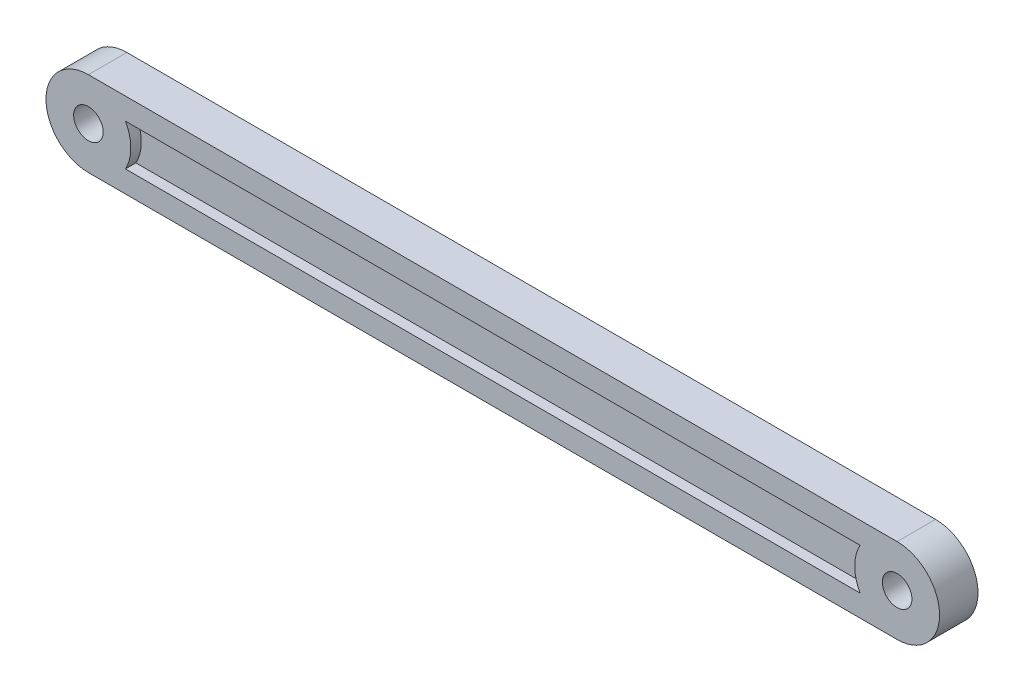
ISO-10303-21;
HEADER;
FILE_DESCRIPTION(('STEP AP214'),'2;1');
FILE_NAME('part.step','',(''),(''),'','','');
FILE_SCHEMA(('AUTOMOTIVE_DESIGN { 1 0 10303 214 1 1 1 1 }'));
ENDSEC;
DATA;
#1=APPLICATION_CONTEXT('core data for automotive mechanical design processes');
#2=APPLICATION_PROTOCOL_DEFINITION('international standard','automotive_design',2000,#1);
#3=PRODUCT_CONTEXT('',#1,'mechanical');
#4=PRODUCT('Part','Part','',(#3));
#5=PRODUCT_RELATED_PRODUCT_CATEGORY('part','',(#4));
#6=PRODUCT_DEFINITION_FORMATION('','',#4);
#7=PRODUCT_DEFINITION_CONTEXT('part definition',#1,'design');
#8=PRODUCT_DEFINITION('design','',#6,#7);
#9=PRODUCT_DEFINITION_SHAPE('','',#8);
#10=(LENGTH_UNIT() NAMED_UNIT(*) SI_UNIT(.MILLI.,.METRE.));
#11=(NAMED_UNIT(*) PLANE_ANGLE_UNIT() SI_UNIT($,.RADIAN.));
#12=(NAMED_UNIT(*) SI_UNIT($,.STERADIAN.) SOLID_ANGLE_UNIT());
#13=UNCERTAINTY_MEASURE_WITH_UNIT(LENGTH_MEASURE(1.E-05),#10,'distance_accuracy_value','');
#14=(GEOMETRIC_REPRESENTATION_CONTEXT(3) GLOBAL_UNCERTAINTY_ASSIGNED_CONTEXT((#13)) GLOBAL_UNIT_ASSIGNED_CONTEXT((#10,
#11,#12)) REPRESENTATION_CONTEXT('',''));
#15=CARTESIAN_POINT('',(0.,0.,0.));
#16=DIRECTION('',(0.,0.,1.));
#17=DIRECTION('',(1.,0.,0.));
#18=AXIS2_PLACEMENT_3D('',#15,#16,#17);
#19=CARTESIAN_POINT('',(41.,0.,1.95));
#20=DIRECTION('',(0.,0.,1.));
#21=DIRECTION('',(1.,0.,0.));
#22=AXIS2_PLACEMENT_3D('',#19,#20,#21);
#23=PLANE('',#22);
#24=CARTESIAN_POINT('',(-41.,0.,1.95));
#25=DIRECTION('',(0.,0.,1.));
#26=DIRECTION('',(1.,0.,0.));
#27=AXIS2_PLACEMENT_3D('',#24,#25,#26);
#28=CIRCLE('',#27,1.5);
#29=CARTESIAN_POINT('',(-39.5,0.,1.95));
#30=VERTEX_POINT('',#29);
#31=EDGE_CURVE('E227',#30,#30,#28,.T.);
#32=ORIENTED_EDGE('',*,*,#31,.F.);
#33=EDGE_LOOP('',(#32));
#34=FACE_BOUND('',#33,.T.);
#35=CARTESIAN_POINT('',(41.,0.,1.95));
#36=DIRECTION('',(0.,0.,1.));
#37=DIRECTION('',(1.,0.,0.));
#38=AXIS2_PLACEMENT_3D('',#35,#36,#37);
#39=CIRCLE('',#38,4.3);
#40=CARTESIAN_POINT('',(41.,-4.29999999999998,1.95));
#41=VERTEX_POINT('',#40);
#42=CARTESIAN_POINT('',(41.,4.30000000000001,1.95));
#43=VERTEX_POINT('',#42);
#44=EDGE_CURVE('E235',#41,#43,#39,.T.);
#45=ORIENTED_EDGE('',*,*,#44,.T.);
#46=DIRECTION('',(-1.,0.,0.));
#47=VECTOR('',#46,1.);
#48=CARTESIAN_POINT('',(41.,4.30000000000001,1.95));
#49=LINE('',#48,#47);
#50=CARTESIAN_POINT('',(-41.,4.29999999999999,1.95));
#51=VERTEX_POINT('',#50);
#52=EDGE_CURVE('E239',#43,#51,#49,.T.);
#53=ORIENTED_EDGE('',*,*,#52,.T.);
#54=CARTESIAN_POINT('',(-41.,0.,1.95));
#55=DIRECTION('',(0.,0.,1.));
#56=DIRECTION('',(1.,0.,0.));
#57=AXIS2_PLACEMENT_3D('',#54,#55,#56);
#58=CIRCLE('',#57,4.3);
#59=CARTESIAN_POINT('',(-41.,-4.30000000000001,1.95));
#60=VERTEX_POINT('',#59);
#61=EDGE_CURVE('E243',#51,#60,#58,.T.);
#62=ORIENTED_EDGE('',*,*,#61,.T.);
#63=DIRECTION('',(1.,0.,0.));
#64=VECTOR('',#63,1.);
#65=CARTESIAN_POINT('',(41.,-4.29999999999998,1.95));
#66=LINE('',#65,#64);
#67=EDGE_CURVE('E246',#60,#41,#66,.T.);
#68=ORIENTED_EDGE('',*,*,#67,.T.);
#69=EDGE_LOOP('',(#45,#53,#62,#68));
#70=FACE_BOUND('',#69,.T.);
#71=CARTESIAN_POINT('',(41.,0.,1.95));
#72=DIRECTION('',(0.,0.,1.));
#73=DIRECTION('',(1.,0.,0.));
#74=AXIS2_PLACEMENT_3D('',#71,#72,#73);
#75=CIRCLE('',#74,1.5);
#76=CARTESIAN_POINT('',(42.5,0.,1.95));
#77=VERTEX_POINT('',#76);
#78=EDGE_CURVE('E219',#77,#77,#75,.T.);
#79=ORIENTED_EDGE('',*,*,#78,.F.);
#80=EDGE_LOOP('',(#79));
#81=FACE_BOUND('',#80,.T.);
#82=DIRECTION('',(-1.,0.,0.));
#83=VECTOR('',#82,1.);
#84=CARTESIAN_POINT('',(0.,2.10000000000001,1.95));
#85=LINE('',#84,#83);
#86=CARTESIAN_POINT('',(37.2476673921413,2.10000000000001,1.95));
#87=VERTEX_POINT('',#86);
#88=CARTESIAN_POINT('',(-37.2476673921413,2.10000000000001,1.95));
#89=VERTEX_POINT('',#88);
#90=EDGE_CURVE('E196',#87,#89,#85,.T.);
#91=ORIENTED_EDGE('',*,*,#90,.F.);
#92=CARTESIAN_POINT('',(41.,0.,1.95));
#93=DIRECTION('',(0.,0.,1.));
#94=DIRECTION('',(1.,0.,0.));
#95=AXIS2_PLACEMENT_3D('',#92,#93,#94);
#96=CIRCLE('',#95,4.3);
#97=CARTESIAN_POINT('',(37.2476673921413,-2.09999999999999,1.95));
#98=VERTEX_POINT('',#97);
#99=EDGE_CURVE('E63',#87,#98,#96,.T.);
#100=ORIENTED_EDGE('',*,*,#99,.T.);
#101=DIRECTION('',(1.,0.,0.));
#102=VECTOR('',#101,1.);
#103=CARTESIAN_POINT('',(0.,-2.1,1.95));
#104=LINE('',#103,#102);
#105=CARTESIAN_POINT('',(-37.2476673921413,-2.10000000000001,1.95));
#106=VERTEX_POINT('',#105);
#107=EDGE_CURVE('E182',#106,#98,#104,.T.);
#108=ORIENTED_EDGE('',*,*,#107,.F.);
#109=CARTESIAN_POINT('',(-41.,0.,1.95));
#110=DIRECTION('',(0.,0.,1.));
#111=DIRECTION('',(1.,0.,0.));
#112=AXIS2_PLACEMENT_3D('',#109,#110,#111);
#113=CIRCLE('',#112,4.3);
#114=EDGE_CURVE('E200',#106,#89,#113,.T.);
#115=ORIENTED_EDGE('',*,*,#114,.T.);
#116=EDGE_LOOP('',(#91,#100,#108,#115));
#117=FACE_BOUND('',#116,.T.);
#118=ADVANCED_FACE('F39',(#34,#70,#81,#117),#23,.T.);
#119=CARTESIAN_POINT('',(41.,0.,-1.95));
#120=DIRECTION('',(0.,0.,1.));
#121=DIRECTION('',(1.,0.,0.));
#122=AXIS2_PLACEMENT_3D('',#119,#120,#121);
#123=PLANE('',#122);
#124=DIRECTION('',(1.,0.,0.));
#125=VECTOR('',#124,1.);
#126=CARTESIAN_POINT('',(0.,-2.1,-1.95));
#127=LINE('',#126,#125);
#128=CARTESIAN_POINT('',(-37.2476673921413,-2.10000000000001,-1.95));
#129=VERTEX_POINT('',#128);
#130=CARTESIAN_POINT('',(37.2476673921413,-2.09999999999999,-1.95));
#131=VERTEX_POINT('',#130);
#132=EDGE_CURVE('E164',#129,#131,#127,.T.);
#133=ORIENTED_EDGE('',*,*,#132,.T.);
#134=CARTESIAN_POINT('',(41.,0.,-1.95));
#135=DIRECTION('',(0.,0.,1.));
#136=DIRECTION('',(1.,0.,0.));
#137=AXIS2_PLACEMENT_3D('',#134,#135,#136);
#138=CIRCLE('',#137,4.3);
#139=CARTESIAN_POINT('',(37.2476673921413,2.10000000000001,-1.95));
#140=VERTEX_POINT('',#139);
#141=EDGE_CURVE('E55',#140,#131,#138,.T.);
#142=ORIENTED_EDGE('',*,*,#141,.F.);
#143=DIRECTION('',(-1.,0.,0.));
#144=VECTOR('',#143,1.);
#145=CARTESIAN_POINT('',(0.,2.10000000000001,-1.95));
#146=LINE('',#145,#144);
#147=CARTESIAN_POINT('',(-37.2476673921413,2.10000000000001,-1.95));
#148=VERTEX_POINT('',#147);
#149=EDGE_CURVE('E151',#140,#148,#146,.T.);
#150=ORIENTED_EDGE('',*,*,#149,.T.);
#151=CARTESIAN_POINT('',(-41.,0.,-1.95));
#152=DIRECTION('',(0.,0.,1.));
#153=DIRECTION('',(1.,0.,0.));
#154=AXIS2_PLACEMENT_3D('',#151,#152,#153);
#155=CIRCLE('',#154,4.3);
#156=EDGE_CURVE('E155',#129,#148,#155,.T.);
#157=ORIENTED_EDGE('',*,*,#156,.F.);
#158=EDGE_LOOP('',(#133,#142,#150,#157));
#159=FACE_BOUND('',#158,.T.);
#160=CARTESIAN_POINT('',(41.,0.,-1.95));
#161=DIRECTION('',(0.,0.,1.));
#162=DIRECTION('',(1.,0.,0.));
#163=AXIS2_PLACEMENT_3D('',#160,#161,#162);
#164=CIRCLE('',#163,4.3);
#165=CARTESIAN_POINT('',(41.,-4.29999999999998,-1.95));
#166=VERTEX_POINT('',#165);
#167=CARTESIAN_POINT('',(41.,4.30000000000001,-1.95));
#168=VERTEX_POINT('',#167);
#169=EDGE_CURVE('E231',#166,#168,#164,.T.);
#170=ORIENTED_EDGE('',*,*,#169,.F.);
#171=DIRECTION('',(1.,0.,0.));
#172=VECTOR('',#171,1.);
#173=CARTESIAN_POINT('',(41.,-4.29999999999998,-1.95));
#174=LINE('',#173,#172);
#175=CARTESIAN_POINT('',(-41.,-4.30000000000001,-1.95));
#176=VERTEX_POINT('',#175);
#177=EDGE_CURVE('E240',#176,#166,#174,.T.);
#178=ORIENTED_EDGE('',*,*,#177,.F.);
#179=CARTESIAN_POINT('',(-41.,0.,-1.95));
#180=DIRECTION('',(0.,0.,1.));
#181=DIRECTION('',(1.,0.,0.));
#182=AXIS2_PLACEMENT_3D('',#179,#180,#181);
#183=CIRCLE('',#182,4.3);
#184=CARTESIAN_POINT('',(-41.,4.29999999999999,-1.95));
#185=VERTEX_POINT('',#184);
#186=EDGE_CURVE('E256',#185,#176,#183,.T.);
#187=ORIENTED_EDGE('',*,*,#186,.F.);
#188=DIRECTION('',(-1.,0.,0.));
#189=VECTOR('',#188,1.);
#190=CARTESIAN_POINT('',(41.,4.30000000000001,-1.95));
#191=LINE('',#190,#189);
#192=EDGE_CURVE('E253',#168,#185,#191,.T.);
#193=ORIENTED_EDGE('',*,*,#192,.F.);
#194=EDGE_LOOP('',(#170,#178,#187,#193));
#195=FACE_BOUND('',#194,.T.);
#196=CARTESIAN_POINT('',(-41.,0.,-1.95));
#197=DIRECTION('',(0.,0.,1.));
#198=DIRECTION('',(1.,0.,0.));
#199=AXIS2_PLACEMENT_3D('',#196,#197,#198);
#200=CIRCLE('',#199,1.5);
#201=CARTESIAN_POINT('',(-39.5,0.,-1.95));
#202=VERTEX_POINT('',#201);
#203=EDGE_CURVE('E223',#202,#202,#200,.T.);
#204=ORIENTED_EDGE('',*,*,#203,.T.);
#205=EDGE_LOOP('',(#204));
#206=FACE_BOUND('',#205,.T.);
#207=CARTESIAN_POINT('',(41.,0.,-1.95));
#208=DIRECTION('',(0.,0.,1.));
#209=DIRECTION('',(1.,0.,0.));
#210=AXIS2_PLACEMENT_3D('',#207,#208,#209);
#211=CIRCLE('',#210,1.5);
#212=CARTESIAN_POINT('',(42.5,0.,-1.95));
#213=VERTEX_POINT('',#212);
#214=EDGE_CURVE('E210',#213,#213,#211,.T.);
#215=ORIENTED_EDGE('',*,*,#214,.T.);
#216=EDGE_LOOP('',(#215));
#217=FACE_BOUND('',#216,.T.);
#218=ADVANCED_FACE('F279',(#159,#195,#206,#217),#123,.F.);
#219=CARTESIAN_POINT('',(41.,0.,1.95));
#220=DIRECTION('',(0.,0.,-1.));
#221=DIRECTION('',(-1.,0.,0.));
#222=AXIS2_PLACEMENT_3D('',#219,#220,#221);
#223=CYLINDRICAL_SURFACE('',#222,4.3);
#224=ORIENTED_EDGE('',*,*,#169,.T.);
#225=DIRECTION('',(0.,0.,-1.));
#226=VECTOR('',#225,1.);
#227=CARTESIAN_POINT('',(41.,4.30000000000001,1.95));
#228=LINE('',#227,#226);
#229=EDGE_CURVE('E11',#43,#168,#228,.T.);
#230=ORIENTED_EDGE('',*,*,#229,.F.);
#231=ORIENTED_EDGE('',*,*,#44,.F.);
#232=DIRECTION('',(0.,0.,-1.));
#233=VECTOR('',#232,1.);
#234=CARTESIAN_POINT('',(41.,-4.29999999999998,1.95));
#235=LINE('',#234,#233);
#236=EDGE_CURVE('E249',#41,#166,#235,.T.);
#237=ORIENTED_EDGE('',*,*,#236,.T.);
#238=EDGE_LOOP('',(#224,#230,#231,#237));
#239=FACE_BOUND('',#238,.T.);
#240=ADVANCED_FACE('F41',(#239),#223,.T.);
#241=CARTESIAN_POINT('',(41.,4.30000000000001,1.95));
#242=DIRECTION('',(0.,-1.,0.));
#243=DIRECTION('',(1.,0.,0.));
#244=AXIS2_PLACEMENT_3D('',#241,#242,#243);
#245=PLANE('',#244);
#246=ORIENTED_EDGE('',*,*,#192,.T.);
#247=DIRECTION('',(0.,0.,-1.));
#248=VECTOR('',#247,1.);
#249=CARTESIAN_POINT('',(-41.,4.29999999999999,1.95));
#250=LINE('',#249,#248);
#251=EDGE_CURVE('E48',#51,#185,#250,.T.);
#252=ORIENTED_EDGE('',*,*,#251,.F.);
#253=ORIENTED_EDGE('',*,*,#52,.F.);
#254=ORIENTED_EDGE('',*,*,#229,.T.);
#255=EDGE_LOOP('',(#246,#252,#253,#254));
#256=FACE_BOUND('',#255,.T.);
#257=ADVANCED_FACE('F290',(#256),#245,.F.);
#258=CARTESIAN_POINT('',(-41.,0.,1.95));
#259=DIRECTION('',(0.,0.,-1.));
#260=DIRECTION('',(-1.,0.,0.));
#261=AXIS2_PLACEMENT_3D('',#258,#259,#260);
#262=CYLINDRICAL_SURFACE('',#261,4.3);
#263=ORIENTED_EDGE('',*,*,#186,.T.);
#264=DIRECTION('',(0.,0.,-1.));
#265=VECTOR('',#264,1.);
#266=CARTESIAN_POINT('',(-41.,-4.30000000000001,1.95));
#267=LINE('',#266,#265);
#268=EDGE_CURVE('E264',#60,#176,#267,.T.);
#269=ORIENTED_EDGE('',*,*,#268,.F.);
#270=ORIENTED_EDGE('',*,*,#61,.F.);
#271=ORIENTED_EDGE('',*,*,#251,.T.);
#272=EDGE_LOOP('',(#263,#269,#270,#271));
#273=FACE_BOUND('',#272,.T.);
#274=ADVANCED_FACE('F273',(#273),#262,.T.);
#275=CARTESIAN_POINT('',(41.,-4.29999999999998,1.95));
#276=DIRECTION('',(0.,1.,0.));
#277=DIRECTION('',(-1.,0.,0.));
#278=AXIS2_PLACEMENT_3D('',#275,#276,#277);
#279=PLANE('',#278);
#280=ORIENTED_EDGE('',*,*,#177,.T.);
#281=ORIENTED_EDGE('',*,*,#236,.F.);
#282=ORIENTED_EDGE('',*,*,#67,.F.);
#283=ORIENTED_EDGE('',*,*,#268,.T.);
#284=EDGE_LOOP('',(#280,#281,#282,#283));
#285=FACE_BOUND('',#284,.T.);
#286=ADVANCED_FACE('F283',(#285),#279,.F.);
#287=CARTESIAN_POINT('',(-41.,0.,1.95));
#288=DIRECTION('',(0.,0.,-1.));
#289=DIRECTION('',(-1.,0.,0.));
#290=AXIS2_PLACEMENT_3D('',#287,#288,#289);
#291=CYLINDRICAL_SURFACE('',#290,1.5);
#292=ORIENTED_EDGE('',*,*,#31,.T.);
#293=EDGE_LOOP('',(#292));
#294=FACE_BOUND('',#293,.T.);
#295=ORIENTED_EDGE('',*,*,#203,.F.);
#296=EDGE_LOOP('',(#295));
#297=FACE_BOUND('',#296,.T.);
#298=ADVANCED_FACE('F307',(#294,#297),#291,.F.);
#299=CARTESIAN_POINT('',(41.,0.,1.95));
#300=DIRECTION('',(0.,0.,-1.));
#301=DIRECTION('',(-1.,0.,0.));
#302=AXIS2_PLACEMENT_3D('',#299,#300,#301);
#303=CYLINDRICAL_SURFACE('',#302,1.5);
#304=ORIENTED_EDGE('',*,*,#78,.T.);
#305=EDGE_LOOP('',(#304));
#306=FACE_BOUND('',#305,.T.);
#307=ORIENTED_EDGE('',*,*,#214,.F.);
#308=EDGE_LOOP('',(#307));
#309=FACE_BOUND('',#308,.T.);
#310=ADVANCED_FACE('F314',(#306,#309),#303,.F.);
#311=CARTESIAN_POINT('',(41.,0.,0.89));
#312=DIRECTION('',(0.,0.,1.));
#313=DIRECTION('',(1.,0.,0.));
#314=AXIS2_PLACEMENT_3D('',#311,#312,#313);
#315=CYLINDRICAL_SURFACE('',#314,4.3);
#316=ORIENTED_EDGE('',*,*,#99,.F.);
#317=DIRECTION('',(0.,0.,1.));
#318=VECTOR('',#317,1.);
#319=CARTESIAN_POINT('',(37.2476673921413,2.10000000000001,0.89));
#320=LINE('',#319,#318);
#321=CARTESIAN_POINT('',(37.2476673921413,2.10000000000001,0.89));
#322=VERTEX_POINT('',#321);
#323=EDGE_CURVE('E193',#322,#87,#320,.T.);
#324=ORIENTED_EDGE('',*,*,#323,.F.);
#325=CARTESIAN_POINT('',(41.,0.,0.89));
#326=DIRECTION('',(0.,0.,1.));
#327=DIRECTION('',(1.,0.,0.));
#328=AXIS2_PLACEMENT_3D('',#325,#326,#327);
#329=CIRCLE('',#328,4.3);
#330=CARTESIAN_POINT('',(37.2476673921413,-2.09999999999999,0.89));
#331=VERTEX_POINT('',#330);
#332=EDGE_CURVE('E178',#322,#331,#329,.T.);
#333=ORIENTED_EDGE('',*,*,#332,.T.);
#334=DIRECTION('',(0.,0.,1.));
#335=VECTOR('',#334,1.);
#336=CARTESIAN_POINT('',(37.2476673921413,-2.09999999999999,0.89));
#337=LINE('',#336,#335);
#338=EDGE_CURVE('E207',#331,#98,#337,.T.);
#339=ORIENTED_EDGE('',*,*,#338,.T.);
#340=EDGE_LOOP('',(#316,#324,#333,#339));
#341=FACE_BOUND('',#340,.T.);
#342=ADVANCED_FACE('F319',(#341),#315,.T.);
#343=CARTESIAN_POINT('',(0.,-2.1,0.89));
#344=DIRECTION('',(0.,-1.,0.));
#345=DIRECTION('',(1.,0.,0.));
#346=AXIS2_PLACEMENT_3D('',#343,#344,#345);
#347=PLANE('',#346);
#348=ORIENTED_EDGE('',*,*,#107,.T.);
#349=ORIENTED_EDGE('',*,*,#338,.F.);
#350=DIRECTION('',(1.,0.,0.));
#351=VECTOR('',#350,1.);
#352=CARTESIAN_POINT('',(0.,-2.1,0.89));
#353=LINE('',#352,#351);
#354=CARTESIAN_POINT('',(-37.2476673921413,-2.10000000000001,0.89));
#355=VERTEX_POINT('',#354);
#356=EDGE_CURVE('E189',#355,#331,#353,.T.);
#357=ORIENTED_EDGE('',*,*,#356,.F.);
#358=DIRECTION('',(0.,0.,1.));
#359=VECTOR('',#358,1.);
#360=CARTESIAN_POINT('',(-37.2476673921413,-2.10000000000001,0.89));
#361=LINE('',#360,#359);
#362=EDGE_CURVE('E211',#355,#106,#361,.T.);
#363=ORIENTED_EDGE('',*,*,#362,.T.);
#364=EDGE_LOOP('',(#348,#349,#357,#363));
#365=FACE_BOUND('',#364,.T.);
#366=ADVANCED_FACE('F329',(#365),#347,.F.);
#367=CARTESIAN_POINT('',(-41.,0.,0.89));
#368=DIRECTION('',(0.,0.,1.));
#369=DIRECTION('',(1.,0.,0.));
#370=AXIS2_PLACEMENT_3D('',#367,#368,#369);
#371=CYLINDRICAL_SURFACE('',#370,4.3);
#372=ORIENTED_EDGE('',*,*,#114,.F.);
#373=ORIENTED_EDGE('',*,*,#362,.F.);
#374=CARTESIAN_POINT('',(-41.,0.,0.89));
#375=DIRECTION('',(0.,0.,1.));
#376=DIRECTION('',(1.,0.,0.));
#377=AXIS2_PLACEMENT_3D('',#374,#375,#376);
#378=CIRCLE('',#377,4.3);
#379=CARTESIAN_POINT('',(-37.2476673921413,2.10000000000001,0.89));
#380=VERTEX_POINT('',#379);
#381=EDGE_CURVE('E186',#355,#380,#378,.T.);
#382=ORIENTED_EDGE('',*,*,#381,.T.);
#383=DIRECTION('',(0.,0.,1.));
#384=VECTOR('',#383,1.);
#385=CARTESIAN_POINT('',(-37.2476673921413,2.10000000000001,0.89));
#386=LINE('',#385,#384);
#387=EDGE_CURVE('E214',#380,#89,#386,.T.);
#388=ORIENTED_EDGE('',*,*,#387,.T.);
#389=EDGE_LOOP('',(#372,#373,#382,#388));
#390=FACE_BOUND('',#389,.T.);
#391=ADVANCED_FACE('F336',(#390),#371,.T.);
#392=CARTESIAN_POINT('',(0.,2.10000000000001,0.89));
#393=DIRECTION('',(0.,1.,0.));
#394=DIRECTION('',(-1.,0.,0.));
#395=AXIS2_PLACEMENT_3D('',#392,#393,#394);
#396=PLANE('',#395);
#397=ORIENTED_EDGE('',*,*,#90,.T.);
#398=ORIENTED_EDGE('',*,*,#387,.F.);
#399=DIRECTION('',(-1.,0.,0.));
#400=VECTOR('',#399,1.);
#401=CARTESIAN_POINT('',(0.,2.10000000000001,0.89));
#402=LINE('',#401,#400);
#403=EDGE_CURVE('E181',#322,#380,#402,.T.);
#404=ORIENTED_EDGE('',*,*,#403,.F.);
#405=ORIENTED_EDGE('',*,*,#323,.T.);
#406=EDGE_LOOP('',(#397,#398,#404,#405));
#407=FACE_BOUND('',#406,.T.);
#408=ADVANCED_FACE('F332',(#407),#396,.F.);
#409=CARTESIAN_POINT('',(0.,0.,0.89));
#410=DIRECTION('',(0.,0.,1.));
#411=DIRECTION('',(1.,0.,0.));
#412=AXIS2_PLACEMENT_3D('',#409,#410,#411);
#413=PLANE('',#412);
#414=ORIENTED_EDGE('',*,*,#332,.F.);
#415=ORIENTED_EDGE('',*,*,#403,.T.);
#416=ORIENTED_EDGE('',*,*,#381,.F.);
#417=ORIENTED_EDGE('',*,*,#356,.T.);
#418=EDGE_LOOP('',(#414,#415,#416,#417));
#419=FACE_BOUND('',#418,.T.);
#420=ADVANCED_FACE('F335',(#419),#413,.T.);
#421=CARTESIAN_POINT('',(41.,0.,-0.89));
#422=DIRECTION('',(0.,0.,-1.));
#423=DIRECTION('',(-1.,0.,0.));
#424=AXIS2_PLACEMENT_3D('',#421,#422,#423);
#425=CYLINDRICAL_SURFACE('',#424,4.3);
#426=ORIENTED_EDGE('',*,*,#141,.T.);
#427=DIRECTION('',(0.,0.,-1.));
#428=VECTOR('',#427,1.);
#429=CARTESIAN_POINT('',(37.2476673921413,-2.09999999999999,-0.89));
#430=LINE('',#429,#428);
#431=CARTESIAN_POINT('',(37.2476673921413,-2.09999999999999,-0.89));
#432=VERTEX_POINT('',#431);
#433=EDGE_CURVE('E132',#432,#131,#430,.T.);
#434=ORIENTED_EDGE('',*,*,#433,.F.);
#435=CARTESIAN_POINT('',(41.,0.,-0.89));
#436=DIRECTION('',(0.,0.,1.));
#437=DIRECTION('',(1.,0.,0.));
#438=AXIS2_PLACEMENT_3D('',#435,#436,#437);
#439=CIRCLE('',#438,4.3);
#440=CARTESIAN_POINT('',(37.2476673921413,2.10000000000001,-0.89));
#441=VERTEX_POINT('',#440);
#442=EDGE_CURVE('E141',#441,#432,#439,.T.);
#443=ORIENTED_EDGE('',*,*,#442,.F.);
#444=DIRECTION('',(0.,0.,-1.));
#445=VECTOR('',#444,1.);
#446=CARTESIAN_POINT('',(37.2476673921413,2.10000000000001,-0.89));
#447=LINE('',#446,#445);
#448=EDGE_CURVE('E170',#441,#140,#447,.T.);
#449=ORIENTED_EDGE('',*,*,#448,.T.);
#450=EDGE_LOOP('',(#426,#434,#443,#449));
#451=FACE_BOUND('',#450,.T.);
#452=ADVANCED_FACE('F144',(#451),#425,.T.);
#453=CARTESIAN_POINT('',(0.,2.10000000000001,-0.89));
#454=DIRECTION('',(0.,-1.,0.));
#455=DIRECTION('',(1.,0.,0.));
#456=AXIS2_PLACEMENT_3D('',#453,#454,#455);
#457=PLANE('',#456);
#458=ORIENTED_EDGE('',*,*,#149,.F.);
#459=ORIENTED_EDGE('',*,*,#448,.F.);
#460=DIRECTION('',(-1.,0.,0.));
#461=VECTOR('',#460,1.);
#462=CARTESIAN_POINT('',(0.,2.10000000000001,-0.89));
#463=LINE('',#462,#461);
#464=CARTESIAN_POINT('',(-37.2476673921413,2.10000000000001,-0.89));
#465=VERTEX_POINT('',#464);
#466=EDGE_CURVE('E146',#441,#465,#463,.T.);
#467=ORIENTED_EDGE('',*,*,#466,.T.);
#468=DIRECTION('',(0.,0.,-1.));
#469=VECTOR('',#468,1.);
#470=CARTESIAN_POINT('',(-37.2476673921413,2.10000000000001,-0.89));
#471=LINE('',#470,#469);
#472=EDGE_CURVE('E173',#465,#148,#471,.T.);
#473=ORIENTED_EDGE('',*,*,#472,.T.);
#474=EDGE_LOOP('',(#458,#459,#467,#473));
#475=FACE_BOUND('',#474,.T.);
#476=ADVANCED_FACE('F349',(#475),#457,.T.);
#477=CARTESIAN_POINT('',(-41.,0.,-0.89));
#478=DIRECTION('',(0.,0.,-1.));
#479=DIRECTION('',(-1.,0.,0.));
#480=AXIS2_PLACEMENT_3D('',#477,#478,#479);
#481=CYLINDRICAL_SURFACE('',#480,4.3);
#482=ORIENTED_EDGE('',*,*,#156,.T.);
#483=ORIENTED_EDGE('',*,*,#472,.F.);
#484=CARTESIAN_POINT('',(-41.,0.,-0.89));
#485=DIRECTION('',(0.,0.,1.));
#486=DIRECTION('',(1.,0.,0.));
#487=AXIS2_PLACEMENT_3D('',#484,#485,#486);
#488=CIRCLE('',#487,4.3);
#489=CARTESIAN_POINT('',(-37.2476673921413,-2.10000000000001,-0.89));
#490=VERTEX_POINT('',#489);
#491=EDGE_CURVE('E140',#490,#465,#488,.T.);
#492=ORIENTED_EDGE('',*,*,#491,.F.);
#493=DIRECTION('',(0.,0.,-1.));
#494=VECTOR('',#493,1.);
#495=CARTESIAN_POINT('',(-37.2476673921413,-2.10000000000001,-0.89));
#496=LINE('',#495,#494);
#497=EDGE_CURVE('E134',#490,#129,#496,.T.);
#498=ORIENTED_EDGE('',*,*,#497,.T.);
#499=EDGE_LOOP('',(#482,#483,#492,#498));
#500=FACE_BOUND('',#499,.T.);
#501=ADVANCED_FACE('F352',(#500),#481,.T.);
#502=CARTESIAN_POINT('',(0.,-2.1,-0.89));
#503=DIRECTION('',(0.,1.,0.));
#504=DIRECTION('',(-1.,0.,0.));
#505=AXIS2_PLACEMENT_3D('',#502,#503,#504);
#506=PLANE('',#505);
#507=ORIENTED_EDGE('',*,*,#132,.F.);
#508=ORIENTED_EDGE('',*,*,#497,.F.);
#509=DIRECTION('',(1.,0.,0.));
#510=VECTOR('',#509,1.);
#511=CARTESIAN_POINT('',(0.,-2.1,-0.89));
#512=LINE('',#511,#510);
#513=EDGE_CURVE('E129',#490,#432,#512,.T.);
#514=ORIENTED_EDGE('',*,*,#513,.T.);
#515=ORIENTED_EDGE('',*,*,#433,.T.);
#516=EDGE_LOOP('',(#507,#508,#514,#515));
#517=FACE_BOUND('',#516,.T.);
#518=ADVANCED_FACE('F131',(#517),#506,.T.);
#519=CARTESIAN_POINT('',(0.,0.,-0.89));
#520=DIRECTION('',(0.,0.,-1.));
#521=DIRECTION('',(1.,0.,0.));
#522=AXIS2_PLACEMENT_3D('',#519,#520,#521);
#523=PLANE('',#522);
#524=ORIENTED_EDGE('',*,*,#442,.T.);
#525=ORIENTED_EDGE('',*,*,#513,.F.);
#526=ORIENTED_EDGE('',*,*,#491,.T.);
#527=ORIENTED_EDGE('',*,*,#466,.F.);
#528=EDGE_LOOP('',(#524,#525,#526,#527));
#529=FACE_BOUND('',#528,.T.);
#530=ADVANCED_FACE('F149',(#529),#523,.T.);
#531=CLOSED_SHELL('',(#118,#218,#240,#257,#274,#286,#298,#310,#342,#366,#391,#408,#420,#452,
#476,#501,#518,#530));
#532=MANIFOLD_SOLID_BREP('B2',#531);
#533=ADVANCED_BREP_SHAPE_REPRESENTATION('',(#18,#532),#14);
#534=SHAPE_DEFINITION_REPRESENTATION(#9,#533);
ENDSEC;
END-ISO-10303-21;
